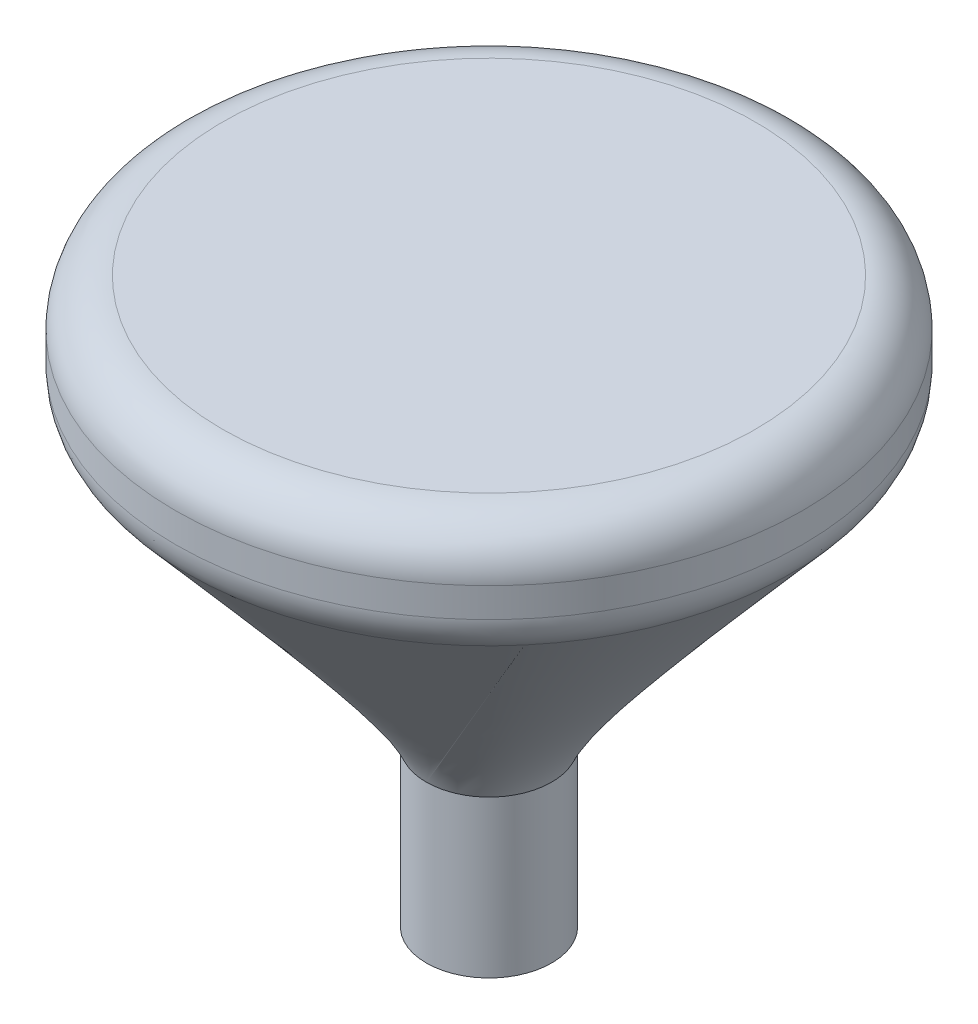
ISO-10303-21;
HEADER;
FILE_DESCRIPTION(('STEP AP214'),'2;1');
FILE_NAME('part.step','',(''),(''),'','','');
FILE_SCHEMA(('AUTOMOTIVE_DESIGN { 1 0 10303 214 1 1 1 1 }'));
ENDSEC;
DATA;
#1=APPLICATION_CONTEXT('core data for automotive mechanical design processes');
#2=APPLICATION_PROTOCOL_DEFINITION('international standard','automotive_design',2000,#1);
#3=PRODUCT_CONTEXT('',#1,'mechanical');
#4=PRODUCT('Part','Part','',(#3));
#5=PRODUCT_RELATED_PRODUCT_CATEGORY('part','',(#4));
#6=PRODUCT_DEFINITION_FORMATION('','',#4);
#7=PRODUCT_DEFINITION_CONTEXT('part definition',#1,'design');
#8=PRODUCT_DEFINITION('design','',#6,#7);
#9=PRODUCT_DEFINITION_SHAPE('','',#8);
#10=(LENGTH_UNIT() NAMED_UNIT(*) SI_UNIT(.MILLI.,.METRE.));
#11=(NAMED_UNIT(*) PLANE_ANGLE_UNIT() SI_UNIT($,.RADIAN.));
#12=(NAMED_UNIT(*) SI_UNIT($,.STERADIAN.) SOLID_ANGLE_UNIT());
#13=UNCERTAINTY_MEASURE_WITH_UNIT(LENGTH_MEASURE(1.E-05),#10,'distance_accuracy_value','');
#14=(GEOMETRIC_REPRESENTATION_CONTEXT(3) GLOBAL_UNCERTAINTY_ASSIGNED_CONTEXT((#13)) GLOBAL_UNIT_ASSIGNED_CONTEXT((#10,
#11,#12)) REPRESENTATION_CONTEXT('',''));
#15=CARTESIAN_POINT('',(0.,0.,0.));
#16=DIRECTION('',(0.,0.,1.));
#17=DIRECTION('',(1.,0.,0.));
#18=AXIS2_PLACEMENT_3D('',#15,#16,#17);
#19=CARTESIAN_POINT('',(0.,18.,0.));
#20=DIRECTION('',(0.,-1.,0.));
#21=DIRECTION('',(0.,0.,-1.));
#22=AXIS2_PLACEMENT_3D('',#19,#20,#21);
#23=CYLINDRICAL_SURFACE('',#22,10.);
#24=CARTESIAN_POINT('',(0.,15.5618387145807,0.));
#25=DIRECTION('',(0.,-1.,0.));
#26=DIRECTION('',(0.,0.,-1.));
#27=AXIS2_PLACEMENT_3D('',#24,#25,#26);
#28=CIRCLE('',#27,10.);
#29=CARTESIAN_POINT('',(0.,15.5618387145807,-10.));
#30=VERTEX_POINT('',#29);
#31=EDGE_CURVE('E44',#30,#30,#28,.F.);
#32=ORIENTED_EDGE('',*,*,#31,.T.);
#33=EDGE_LOOP('',(#32));
#34=FACE_BOUND('',#33,.T.);
#35=CARTESIAN_POINT('',(0.,16.5,0.));
#36=DIRECTION('',(0.,1.,0.));
#37=DIRECTION('',(0.,0.,1.));
#38=AXIS2_PLACEMENT_3D('',#35,#36,#37);
#39=CIRCLE('',#38,10.);
#40=CARTESIAN_POINT('',(0.,16.5,10.));
#41=VERTEX_POINT('',#40);
#42=EDGE_CURVE('E48',#41,#41,#39,.F.);
#43=ORIENTED_EDGE('',*,*,#42,.T.);
#44=EDGE_LOOP('',(#43));
#45=FACE_BOUND('',#44,.T.);
#46=ADVANCED_FACE('F33',(#34,#45),#23,.T.);
#47=CARTESIAN_POINT('',(0.,18.,0.));
#48=DIRECTION('',(0.,1.,0.));
#49=DIRECTION('',(0.,0.,1.));
#50=AXIS2_PLACEMENT_3D('',#47,#48,#49);
#51=PLANE('',#50);
#52=CARTESIAN_POINT('',(0.,18.,0.));
#53=DIRECTION('',(0.,1.,0.));
#54=DIRECTION('',(0.,0.,1.));
#55=AXIS2_PLACEMENT_3D('',#52,#53,#54);
#56=CIRCLE('',#55,8.5);
#57=CARTESIAN_POINT('',(0.,18.,8.5));
#58=VERTEX_POINT('',#57);
#59=EDGE_CURVE('E11',#58,#58,#56,.T.);
#60=ORIENTED_EDGE('',*,*,#59,.T.);
#61=EDGE_LOOP('',(#60));
#62=FACE_BOUND('',#61,.T.);
#63=ADVANCED_FACE('F79',(#62),#51,.T.);
#64=CARTESIAN_POINT('',(0.788145697706598,5.,1.83815841514995));
#65=CARTESIAN_POINT('',(9.5818954233782,15.,2.86134235900635));
#66=CARTESIAN_POINT('',(4.4644625280065,5.,0.261867019736755));
#67=CARTESIAN_POINT('',(15.3045801413909,15.,-16.30244848775));
#68=CARTESIAN_POINT('',(2.8881711325933,5.,-3.41444981056315));
#69=CARTESIAN_POINT('',(-3.8592107053655,15.,-22.0251332057627));
#70=CARTESIAN_POINT('',(-0.788145697706598,5.,-1.83815841514995));
#71=CARTESIAN_POINT('',(-9.58189542337819,15.,-2.86134235900635));
#72=CARTESIAN_POINT('',(-4.4644625280065,5.,-0.261867019736756));
#73=CARTESIAN_POINT('',(-15.3045801413909,15.,16.30244848775));
#74=CARTESIAN_POINT('',(-2.8881711325933,5.,3.41444981056315));
#75=CARTESIAN_POINT('',(3.8592107053655,15.,22.0251332057627));
#76=CARTESIAN_POINT('',(0.788145697706598,5.,1.83815841514995));
#77=CARTESIAN_POINT('',(9.5818954233782,15.,2.86134235900635));
#78=(BOUNDED_SURFACE() B_SPLINE_SURFACE(3,1,((#64,#65),(#66,#67),(#68,#69),(#70,#71),(#72,#73),
(#74,#75),(#76,#77)),.UNSPECIFIED.,.T.,.F.,.F.) B_SPLINE_SURFACE_WITH_KNOTS((4,3,4),(2,2),(0.,
0.5,1.),(0.,1.),.UNSPECIFIED.) GEOMETRIC_REPRESENTATION_ITEM() RATIONAL_B_SPLINE_SURFACE(((1.,
1.),(0.333333333333333,0.333333333333333),(0.333333333333333,0.333333333333333),(1.,1.),
(0.333333333333333,0.333333333333333),(0.333333333333333,0.333333333333333),(1.,1.))) REPRESENTATION_ITEM('') SURFACE());
#79=CARTESIAN_POINT('',(0.,14.5767572735324,0.));
#80=DIRECTION('',(0.,1.,0.));
#81=DIRECTION('',(0.,0.,1.));
#82=AXIS2_PLACEMENT_3D('',#79,#80,#81);
#83=CIRCLE('',#82,9.63120049261926);
#84=CARTESIAN_POINT('',(0.,14.5767572735324,9.63120049261926));
#85=VERTEX_POINT('',#84);
#86=EDGE_CURVE('E40',#85,#85,#83,.F.);
#87=CARTESIAN_POINT('',(0.788145697706602,5.,1.83815841514995));
#88=CARTESIAN_POINT('',(4.4644625280065,5.,0.261867019736749));
#89=CARTESIAN_POINT('',(2.8881711325933,5.,-3.41444981056315));
#90=CARTESIAN_POINT('',(-0.788145697706601,5.,-1.83815841514995));
#91=CARTESIAN_POINT('',(-4.4644625280065,5.,-0.26186701973675));
#92=CARTESIAN_POINT('',(-2.8881711325933,5.,3.41444981056315));
#93=CARTESIAN_POINT('',(0.788145697706602,5.,1.83815841514995));
#94=(BOUNDED_CURVE() B_SPLINE_CURVE(3,(#87,#88,#89,#90,#91,#92,#93),.UNSPECIFIED.,.T.,
.F.) B_SPLINE_CURVE_WITH_KNOTS((4,3,4),(0.,0.5,1.),
.UNSPECIFIED.) CURVE() GEOMETRIC_REPRESENTATION_ITEM() RATIONAL_B_SPLINE_CURVE((1.,
0.333333333333333,0.333333333333333,1.,0.333333333333333,0.333333333333333,1.)) REPRESENTATION_ITEM(''));
#95=CARTESIAN_POINT('',(0.,5.,2.));
#96=VERTEX_POINT('',#95);
#97=EDGE_CURVE('E53',#96,#96,#94,.T.);
#98=ORIENTED_EDGE('',*,*,#86,.T.);
#99=EDGE_LOOP('',(#98));
#100=FACE_BOUND('',#99,.T.);
#101=ORIENTED_EDGE('',*,*,#97,.T.);
#102=EDGE_LOOP('',(#101));
#103=FACE_BOUND('',#102,.T.);
#104=ADVANCED_FACE('F71',(#100,#103),#78,.T.);
#105=CARTESIAN_POINT('',(0.,5.,0.));
#106=DIRECTION('',(0.,-1.,0.));
#107=DIRECTION('',(0.,0.,-1.));
#108=AXIS2_PLACEMENT_3D('',#105,#106,#107);
#109=CYLINDRICAL_SURFACE('',#108,2.);
#110=ORIENTED_EDGE('',*,*,#97,.F.);
#111=EDGE_LOOP('',(#110));
#112=FACE_BOUND('',#111,.T.);
#113=CARTESIAN_POINT('',(0.,0.,0.));
#114=DIRECTION('',(0.,1.,0.));
#115=DIRECTION('',(0.,0.,1.));
#116=AXIS2_PLACEMENT_3D('',#113,#114,#115);
#117=CIRCLE('',#116,2.);
#118=CARTESIAN_POINT('',(0.,0.,2.));
#119=VERTEX_POINT('',#118);
#120=EDGE_CURVE('E97',#119,#119,#117,.T.);
#121=ORIENTED_EDGE('',*,*,#120,.T.);
#122=EDGE_LOOP('',(#121));
#123=FACE_BOUND('',#122,.T.);
#124=ADVANCED_FACE('F60',(#112,#123),#109,.T.);
#125=CARTESIAN_POINT('',(0.,0.,0.));
#126=DIRECTION('',(0.,1.,0.));
#127=DIRECTION('',(0.,0.,1.));
#128=AXIS2_PLACEMENT_3D('',#125,#126,#127);
#129=PLANE('',#128);
#130=CARTESIAN_POINT('',(0.,0.,0.));
#131=DIRECTION('',(0.,-1.,0.));
#132=DIRECTION('',(0.,0.,-1.));
#133=AXIS2_PLACEMENT_3D('',#130,#131,#132);
#134=CIRCLE('',#133,1.);
#135=CARTESIAN_POINT('',(0.,0.,-1.));
#136=VERTEX_POINT('',#135);
#137=EDGE_CURVE('E101',#136,#136,#134,.T.);
#138=ORIENTED_EDGE('',*,*,#137,.F.);
#139=EDGE_LOOP('',(#138));
#140=FACE_BOUND('',#139,.T.);
#141=ORIENTED_EDGE('',*,*,#120,.F.);
#142=EDGE_LOOP('',(#141));
#143=FACE_BOUND('',#142,.T.);
#144=ADVANCED_FACE('F70',(#140,#143),#129,.F.);
#145=CARTESIAN_POINT('',(0.,15.5618387145807,0.));
#146=DIRECTION('',(0.,-1.,0.));
#147=DIRECTION('',(0.,0.,-1.));
#148=AXIS2_PLACEMENT_3D('',#145,#146,#147);
#149=TOROIDAL_SURFACE('',#148,8.5,1.5);
#150=ORIENTED_EDGE('',*,*,#86,.F.);
#151=EDGE_LOOP('',(#150));
#152=FACE_BOUND('',#151,.T.);
#153=ORIENTED_EDGE('',*,*,#31,.F.);
#154=EDGE_LOOP('',(#153));
#155=FACE_BOUND('',#154,.T.);
#156=ADVANCED_FACE('F116',(#152,#155),#149,.T.);
#157=CARTESIAN_POINT('',(0.,16.5,0.));
#158=DIRECTION('',(0.,1.,0.));
#159=DIRECTION('',(0.,0.,1.));
#160=AXIS2_PLACEMENT_3D('',#157,#158,#159);
#161=TOROIDAL_SURFACE('',#160,8.5,1.5);
#162=ORIENTED_EDGE('',*,*,#42,.F.);
#163=EDGE_LOOP('',(#162));
#164=FACE_BOUND('',#163,.T.);
#165=ORIENTED_EDGE('',*,*,#59,.F.);
#166=EDGE_LOOP('',(#165));
#167=FACE_BOUND('',#166,.T.);
#168=ADVANCED_FACE('F35',(#164,#167),#161,.T.);
#169=CARTESIAN_POINT('',(0.,15.,0.));
#170=DIRECTION('',(0.,-1.,0.));
#171=DIRECTION('',(0.,0.,-1.));
#172=AXIS2_PLACEMENT_3D('',#169,#170,#171);
#173=CYLINDRICAL_SURFACE('',#172,1.);
#174=CARTESIAN_POINT('',(0.,15.,0.));
#175=DIRECTION('',(0.,-1.,0.));
#176=DIRECTION('',(0.,0.,-1.));
#177=AXIS2_PLACEMENT_3D('',#174,#175,#176);
#178=CIRCLE('',#177,1.);
#179=CARTESIAN_POINT('',(0.,15.,-1.));
#180=VERTEX_POINT('',#179);
#181=EDGE_CURVE('E100',#180,#180,#178,.T.);
#182=ORIENTED_EDGE('',*,*,#181,.F.);
#183=EDGE_LOOP('',(#182));
#184=FACE_BOUND('',#183,.T.);
#185=ORIENTED_EDGE('',*,*,#137,.T.);
#186=EDGE_LOOP('',(#185));
#187=FACE_BOUND('',#186,.T.);
#188=ADVANCED_FACE('F109',(#184,#187),#173,.F.);
#189=CARTESIAN_POINT('',(0.,15.,0.));
#190=DIRECTION('',(0.,-1.,0.));
#191=DIRECTION('',(0.,0.,-1.));
#192=AXIS2_PLACEMENT_3D('',#189,#190,#191);
#193=PLANE('',#192);
#194=ORIENTED_EDGE('',*,*,#181,.T.);
#195=EDGE_LOOP('',(#194));
#196=FACE_BOUND('',#195,.T.);
#197=ADVANCED_FACE('F107',(#196),#193,.T.);
#198=CLOSED_SHELL('',(#46,#63,#104,#124,#144,#156,#168,#188,#197));
#199=MANIFOLD_SOLID_BREP('B2',#198);
#200=ADVANCED_BREP_SHAPE_REPRESENTATION('',(#18,#199),#14);
#201=SHAPE_DEFINITION_REPRESENTATION(#9,#200);
ENDSEC;
END-ISO-10303-21;
